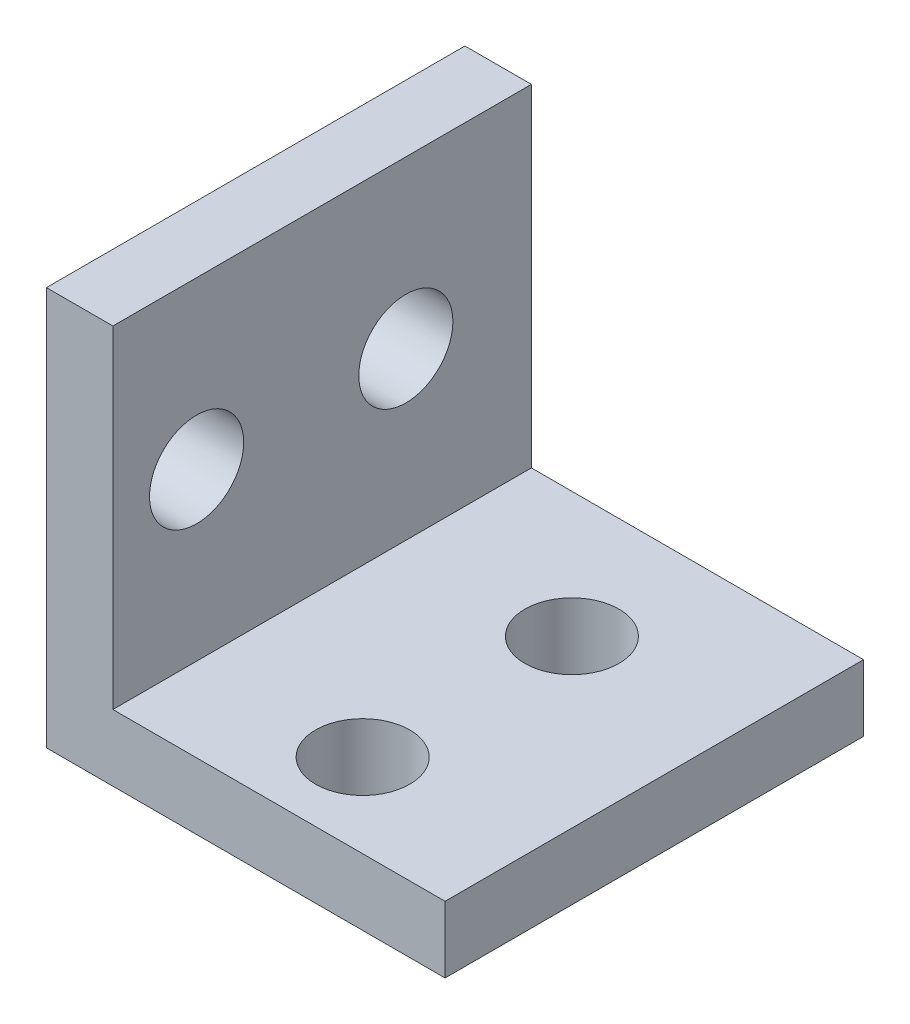
ISO-10303-21;
HEADER;
FILE_DESCRIPTION(('STEP AP214'),'2;1');
FILE_NAME('part.step','',(''),(''),'','','');
FILE_SCHEMA(('AUTOMOTIVE_DESIGN { 1 0 10303 214 1 1 1 1 }'));
ENDSEC;
DATA;
#1=APPLICATION_CONTEXT('core data for automotive mechanical design processes');
#2=APPLICATION_PROTOCOL_DEFINITION('international standard','automotive_design',2000,#1);
#3=PRODUCT_CONTEXT('',#1,'mechanical');
#4=PRODUCT('Part','Part','',(#3));
#5=PRODUCT_RELATED_PRODUCT_CATEGORY('part','',(#4));
#6=PRODUCT_DEFINITION_FORMATION('','',#4);
#7=PRODUCT_DEFINITION_CONTEXT('part definition',#1,'design');
#8=PRODUCT_DEFINITION('design','',#6,#7);
#9=PRODUCT_DEFINITION_SHAPE('','',#8);
#10=(LENGTH_UNIT() NAMED_UNIT(*) SI_UNIT(.MILLI.,.METRE.));
#11=(NAMED_UNIT(*) PLANE_ANGLE_UNIT() SI_UNIT($,.RADIAN.));
#12=(NAMED_UNIT(*) SI_UNIT($,.STERADIAN.) SOLID_ANGLE_UNIT());
#13=UNCERTAINTY_MEASURE_WITH_UNIT(LENGTH_MEASURE(1.E-05),#10,'distance_accuracy_value','');
#14=(GEOMETRIC_REPRESENTATION_CONTEXT(3) GLOBAL_UNCERTAINTY_ASSIGNED_CONTEXT((#13)) GLOBAL_UNIT_ASSIGNED_CONTEXT((#10,
#11,#12)) REPRESENTATION_CONTEXT('',''));
#15=CARTESIAN_POINT('',(0.,0.,0.));
#16=DIRECTION('',(0.,0.,1.));
#17=DIRECTION('',(1.,0.,0.));
#18=AXIS2_PLACEMENT_3D('',#15,#16,#17);
#19=CARTESIAN_POINT('',(0.,3.175,20.));
#20=DIRECTION('',(0.,-1.,0.));
#21=DIRECTION('',(0.,0.,-1.));
#22=AXIS2_PLACEMENT_3D('',#19,#20,#21);
#23=PLANE('',#22);
#24=CARTESIAN_POINT('',(11.1125,3.175,6.));
#25=DIRECTION('',(0.,1.,0.));
#26=DIRECTION('',(0.,0.,1.));
#27=AXIS2_PLACEMENT_3D('',#24,#25,#26);
#28=CIRCLE('',#27,2.25);
#29=CARTESIAN_POINT('',(11.1125,3.175,8.25));
#30=VERTEX_POINT('',#29);
#31=EDGE_CURVE('E170',#30,#30,#28,.T.);
#32=ORIENTED_EDGE('',*,*,#31,.F.);
#33=EDGE_LOOP('',(#32));
#34=FACE_BOUND('',#33,.T.);
#35=CARTESIAN_POINT('',(11.1125,3.175,16.));
#36=DIRECTION('',(0.,1.,0.));
#37=DIRECTION('',(0.,0.,1.));
#38=AXIS2_PLACEMENT_3D('',#35,#36,#37);
#39=CIRCLE('',#38,2.25);
#40=CARTESIAN_POINT('',(11.1125,3.175,18.25));
#41=VERTEX_POINT('',#40);
#42=EDGE_CURVE('E176',#41,#41,#39,.T.);
#43=ORIENTED_EDGE('',*,*,#42,.F.);
#44=EDGE_LOOP('',(#43));
#45=FACE_BOUND('',#44,.T.);
#46=DIRECTION('',(0.,0.,-1.));
#47=VECTOR('',#46,1.);
#48=CARTESIAN_POINT('',(3.175,3.175,20.));
#49=LINE('',#48,#47);
#50=CARTESIAN_POINT('',(3.175,3.175,20.));
#51=VERTEX_POINT('',#50);
#52=CARTESIAN_POINT('',(3.175,3.175,0.));
#53=VERTEX_POINT('',#52);
#54=EDGE_CURVE('E11',#51,#53,#49,.T.);
#55=ORIENTED_EDGE('',*,*,#54,.F.);
#56=DIRECTION('',(-1.,0.,0.));
#57=VECTOR('',#56,1.);
#58=CARTESIAN_POINT('',(0.,3.175,20.));
#59=LINE('',#58,#57);
#60=CARTESIAN_POINT('',(19.05,3.175,20.));
#61=VERTEX_POINT('',#60);
#62=EDGE_CURVE('E88',#61,#51,#59,.T.);
#63=ORIENTED_EDGE('',*,*,#62,.F.);
#64=DIRECTION('',(0.,0.,-1.));
#65=VECTOR('',#64,1.);
#66=CARTESIAN_POINT('',(19.05,3.175,20.));
#67=LINE('',#66,#65);
#68=CARTESIAN_POINT('',(19.05,3.175,0.));
#69=VERTEX_POINT('',#68);
#70=EDGE_CURVE('E55',#61,#69,#67,.T.);
#71=ORIENTED_EDGE('',*,*,#70,.T.);
#72=DIRECTION('',(-1.,0.,0.));
#73=VECTOR('',#72,1.);
#74=CARTESIAN_POINT('',(0.,3.175,0.));
#75=LINE('',#74,#73);
#76=EDGE_CURVE('E133',#69,#53,#75,.T.);
#77=ORIENTED_EDGE('',*,*,#76,.T.);
#78=EDGE_LOOP('',(#55,#63,#71,#77));
#79=FACE_BOUND('',#78,.T.);
#80=ADVANCED_FACE('F43',(#34,#45,#79),#23,.F.);
#81=CARTESIAN_POINT('',(19.05,0.,20.));
#82=DIRECTION('',(-1.,0.,0.));
#83=DIRECTION('',(0.,0.,1.));
#84=AXIS2_PLACEMENT_3D('',#81,#82,#83);
#85=PLANE('',#84);
#86=DIRECTION('',(0.,1.,0.));
#87=VECTOR('',#86,1.);
#88=CARTESIAN_POINT('',(19.05,0.,0.));
#89=LINE('',#88,#87);
#90=CARTESIAN_POINT('',(19.05,0.,0.));
#91=VERTEX_POINT('',#90);
#92=EDGE_CURVE('E127',#91,#69,#89,.T.);
#93=ORIENTED_EDGE('',*,*,#92,.T.);
#94=ORIENTED_EDGE('',*,*,#70,.F.);
#95=DIRECTION('',(0.,1.,0.));
#96=VECTOR('',#95,1.);
#97=CARTESIAN_POINT('',(19.05,0.,20.));
#98=LINE('',#97,#96);
#99=CARTESIAN_POINT('',(19.05,0.,20.));
#100=VERTEX_POINT('',#99);
#101=EDGE_CURVE('E136',#100,#61,#98,.T.);
#102=ORIENTED_EDGE('',*,*,#101,.F.);
#103=DIRECTION('',(0.,0.,-1.));
#104=VECTOR('',#103,1.);
#105=CARTESIAN_POINT('',(19.05,0.,20.));
#106=LINE('',#105,#104);
#107=EDGE_CURVE('E148',#100,#91,#106,.T.);
#108=ORIENTED_EDGE('',*,*,#107,.T.);
#109=EDGE_LOOP('',(#93,#94,#102,#108));
#110=FACE_BOUND('',#109,.T.);
#111=ADVANCED_FACE('F44',(#110),#85,.F.);
#112=CARTESIAN_POINT('',(0.,0.,20.));
#113=DIRECTION('',(1.,0.,0.));
#114=DIRECTION('',(0.,0.,-1.));
#115=AXIS2_PLACEMENT_3D('',#112,#113,#114);
#116=PLANE('',#115);
#117=CARTESIAN_POINT('',(0.,11.1125,6.));
#118=DIRECTION('',(1.,0.,0.));
#119=DIRECTION('',(0.,0.,-1.));
#120=AXIS2_PLACEMENT_3D('',#117,#118,#119);
#121=CIRCLE('',#120,2.25);
#122=CARTESIAN_POINT('',(0.,11.1125,3.75));
#123=VERTEX_POINT('',#122);
#124=EDGE_CURVE('E192',#123,#123,#121,.T.);
#125=ORIENTED_EDGE('',*,*,#124,.T.);
#126=EDGE_LOOP('',(#125));
#127=FACE_BOUND('',#126,.T.);
#128=CARTESIAN_POINT('',(0.,11.1125,16.));
#129=DIRECTION('',(1.,0.,0.));
#130=DIRECTION('',(0.,0.,-1.));
#131=AXIS2_PLACEMENT_3D('',#128,#129,#130);
#132=CIRCLE('',#131,2.25);
#133=CARTESIAN_POINT('',(0.,11.1125,13.75));
#134=VERTEX_POINT('',#133);
#135=EDGE_CURVE('E194',#134,#134,#132,.T.);
#136=ORIENTED_EDGE('',*,*,#135,.T.);
#137=EDGE_LOOP('',(#136));
#138=FACE_BOUND('',#137,.T.);
#139=DIRECTION('',(0.,-1.,0.));
#140=VECTOR('',#139,1.);
#141=CARTESIAN_POINT('',(0.,0.,0.));
#142=LINE('',#141,#140);
#143=CARTESIAN_POINT('',(0.,19.05,0.));
#144=VERTEX_POINT('',#143);
#145=CARTESIAN_POINT('',(0.,0.,0.));
#146=VERTEX_POINT('',#145);
#147=EDGE_CURVE('E147',#144,#146,#142,.T.);
#148=ORIENTED_EDGE('',*,*,#147,.T.);
#149=DIRECTION('',(0.,0.,-1.));
#150=VECTOR('',#149,1.);
#151=CARTESIAN_POINT('',(0.,0.,20.));
#152=LINE('',#151,#150);
#153=CARTESIAN_POINT('',(0.,0.,20.));
#154=VERTEX_POINT('',#153);
#155=EDGE_CURVE('E160',#154,#146,#152,.T.);
#156=ORIENTED_EDGE('',*,*,#155,.F.);
#157=DIRECTION('',(0.,-1.,0.));
#158=VECTOR('',#157,1.);
#159=CARTESIAN_POINT('',(0.,0.,20.));
#160=LINE('',#159,#158);
#161=CARTESIAN_POINT('',(0.,19.05,20.));
#162=VERTEX_POINT('',#161);
#163=EDGE_CURVE('E142',#162,#154,#160,.T.);
#164=ORIENTED_EDGE('',*,*,#163,.F.);
#165=DIRECTION('',(0.,0.,-1.));
#166=VECTOR('',#165,1.);
#167=CARTESIAN_POINT('',(0.,19.05,20.));
#168=LINE('',#167,#166);
#169=EDGE_CURVE('E117',#162,#144,#168,.T.);
#170=ORIENTED_EDGE('',*,*,#169,.T.);
#171=EDGE_LOOP('',(#148,#156,#164,#170));
#172=FACE_BOUND('',#171,.T.);
#173=ADVANCED_FACE('F220',(#127,#138,#172),#116,.F.);
#174=CARTESIAN_POINT('',(0.,0.,20.));
#175=DIRECTION('',(0.,1.,0.));
#176=DIRECTION('',(0.,0.,1.));
#177=AXIS2_PLACEMENT_3D('',#174,#175,#176);
#178=PLANE('',#177);
#179=CARTESIAN_POINT('',(11.1125,0.,6.));
#180=DIRECTION('',(0.,1.,0.));
#181=DIRECTION('',(0.,0.,1.));
#182=AXIS2_PLACEMENT_3D('',#179,#180,#181);
#183=CIRCLE('',#182,2.25);
#184=CARTESIAN_POINT('',(11.1125,0.,8.25));
#185=VERTEX_POINT('',#184);
#186=EDGE_CURVE('E175',#185,#185,#183,.T.);
#187=ORIENTED_EDGE('',*,*,#186,.T.);
#188=EDGE_LOOP('',(#187));
#189=FACE_BOUND('',#188,.T.);
#190=CARTESIAN_POINT('',(11.1125,0.,16.));
#191=DIRECTION('',(0.,1.,0.));
#192=DIRECTION('',(0.,0.,1.));
#193=AXIS2_PLACEMENT_3D('',#190,#191,#192);
#194=CIRCLE('',#193,2.25);
#195=CARTESIAN_POINT('',(11.1125,0.,18.25));
#196=VERTEX_POINT('',#195);
#197=EDGE_CURVE('E177',#196,#196,#194,.T.);
#198=ORIENTED_EDGE('',*,*,#197,.T.);
#199=EDGE_LOOP('',(#198));
#200=FACE_BOUND('',#199,.T.);
#201=ORIENTED_EDGE('',*,*,#107,.F.);
#202=DIRECTION('',(1.,0.,0.));
#203=VECTOR('',#202,1.);
#204=CARTESIAN_POINT('',(0.,0.,20.));
#205=LINE('',#204,#203);
#206=EDGE_CURVE('E69',#154,#100,#205,.T.);
#207=ORIENTED_EDGE('',*,*,#206,.F.);
#208=ORIENTED_EDGE('',*,*,#155,.T.);
#209=DIRECTION('',(1.,0.,0.));
#210=VECTOR('',#209,1.);
#211=CARTESIAN_POINT('',(0.,0.,0.));
#212=LINE('',#211,#210);
#213=EDGE_CURVE('E85',#146,#91,#212,.T.);
#214=ORIENTED_EDGE('',*,*,#213,.T.);
#215=EDGE_LOOP('',(#201,#207,#208,#214));
#216=FACE_BOUND('',#215,.T.);
#217=ADVANCED_FACE('F219',(#189,#200,#216),#178,.F.);
#218=CARTESIAN_POINT('',(0.,0.,20.));
#219=DIRECTION('',(0.,0.,-1.));
#220=DIRECTION('',(-1.,0.,0.));
#221=AXIS2_PLACEMENT_3D('',#218,#219,#220);
#222=PLANE('',#221);
#223=ORIENTED_EDGE('',*,*,#206,.T.);
#224=ORIENTED_EDGE('',*,*,#101,.T.);
#225=ORIENTED_EDGE('',*,*,#62,.T.);
#226=DIRECTION('',(0.,1.,0.));
#227=VECTOR('',#226,1.);
#228=CARTESIAN_POINT('',(3.175,0.,20.));
#229=LINE('',#228,#227);
#230=CARTESIAN_POINT('',(3.175,19.05,20.));
#231=VERTEX_POINT('',#230);
#232=EDGE_CURVE('E105',#51,#231,#229,.T.);
#233=ORIENTED_EDGE('',*,*,#232,.T.);
#234=DIRECTION('',(-1.,0.,0.));
#235=VECTOR('',#234,1.);
#236=CARTESIAN_POINT('',(0.,19.05,20.));
#237=LINE('',#236,#235);
#238=EDGE_CURVE('E104',#231,#162,#237,.T.);
#239=ORIENTED_EDGE('',*,*,#238,.T.);
#240=ORIENTED_EDGE('',*,*,#163,.T.);
#241=EDGE_LOOP('',(#223,#224,#225,#233,#239,#240));
#242=FACE_BOUND('',#241,.T.);
#243=ADVANCED_FACE('F102',(#242),#222,.F.);
#244=CARTESIAN_POINT('',(0.,0.,0.));
#245=DIRECTION('',(0.,0.,-1.));
#246=DIRECTION('',(-1.,0.,0.));
#247=AXIS2_PLACEMENT_3D('',#244,#245,#246);
#248=PLANE('',#247);
#249=ORIENTED_EDGE('',*,*,#147,.F.);
#250=DIRECTION('',(-1.,0.,0.));
#251=VECTOR('',#250,1.);
#252=CARTESIAN_POINT('',(0.,19.05,0.));
#253=LINE('',#252,#251);
#254=CARTESIAN_POINT('',(3.175,19.05,0.));
#255=VERTEX_POINT('',#254);
#256=EDGE_CURVE('E109',#255,#144,#253,.T.);
#257=ORIENTED_EDGE('',*,*,#256,.F.);
#258=DIRECTION('',(0.,1.,0.));
#259=VECTOR('',#258,1.);
#260=CARTESIAN_POINT('',(3.175,0.,0.));
#261=LINE('',#260,#259);
#262=EDGE_CURVE('E125',#53,#255,#261,.T.);
#263=ORIENTED_EDGE('',*,*,#262,.F.);
#264=ORIENTED_EDGE('',*,*,#76,.F.);
#265=ORIENTED_EDGE('',*,*,#92,.F.);
#266=ORIENTED_EDGE('',*,*,#213,.F.);
#267=EDGE_LOOP('',(#249,#257,#263,#264,#265,#266));
#268=FACE_BOUND('',#267,.T.);
#269=ADVANCED_FACE('F164',(#268),#248,.T.);
#270=CARTESIAN_POINT('',(3.175,0.,20.));
#271=DIRECTION('',(-1.,0.,0.));
#272=DIRECTION('',(0.,0.,1.));
#273=AXIS2_PLACEMENT_3D('',#270,#271,#272);
#274=PLANE('',#273);
#275=CARTESIAN_POINT('',(3.175,11.1125,6.));
#276=DIRECTION('',(1.,0.,0.));
#277=DIRECTION('',(0.,0.,-1.));
#278=AXIS2_PLACEMENT_3D('',#275,#276,#277);
#279=CIRCLE('',#278,2.25);
#280=CARTESIAN_POINT('',(3.175,11.1125,3.75));
#281=VERTEX_POINT('',#280);
#282=EDGE_CURVE('E182',#281,#281,#279,.T.);
#283=ORIENTED_EDGE('',*,*,#282,.F.);
#284=EDGE_LOOP('',(#283));
#285=FACE_BOUND('',#284,.T.);
#286=CARTESIAN_POINT('',(3.175,11.1125,16.));
#287=DIRECTION('',(1.,0.,0.));
#288=DIRECTION('',(0.,0.,-1.));
#289=AXIS2_PLACEMENT_3D('',#286,#287,#288);
#290=CIRCLE('',#289,2.25);
#291=CARTESIAN_POINT('',(3.175,11.1125,13.75));
#292=VERTEX_POINT('',#291);
#293=EDGE_CURVE('E187',#292,#292,#290,.T.);
#294=ORIENTED_EDGE('',*,*,#293,.F.);
#295=EDGE_LOOP('',(#294));
#296=FACE_BOUND('',#295,.T.);
#297=ORIENTED_EDGE('',*,*,#232,.F.);
#298=ORIENTED_EDGE('',*,*,#54,.T.);
#299=ORIENTED_EDGE('',*,*,#262,.T.);
#300=DIRECTION('',(0.,0.,-1.));
#301=VECTOR('',#300,1.);
#302=CARTESIAN_POINT('',(3.175,19.05,20.));
#303=LINE('',#302,#301);
#304=EDGE_CURVE('E118',#231,#255,#303,.T.);
#305=ORIENTED_EDGE('',*,*,#304,.F.);
#306=EDGE_LOOP('',(#297,#298,#299,#305));
#307=FACE_BOUND('',#306,.T.);
#308=ADVANCED_FACE('F124',(#285,#296,#307),#274,.F.);
#309=CARTESIAN_POINT('',(0.,19.05,20.));
#310=DIRECTION('',(0.,-1.,0.));
#311=DIRECTION('',(0.,0.,-1.));
#312=AXIS2_PLACEMENT_3D('',#309,#310,#311);
#313=PLANE('',#312);
#314=ORIENTED_EDGE('',*,*,#256,.T.);
#315=ORIENTED_EDGE('',*,*,#169,.F.);
#316=ORIENTED_EDGE('',*,*,#238,.F.);
#317=ORIENTED_EDGE('',*,*,#304,.T.);
#318=EDGE_LOOP('',(#314,#315,#316,#317));
#319=FACE_BOUND('',#318,.T.);
#320=ADVANCED_FACE('F113',(#319),#313,.F.);
#321=CARTESIAN_POINT('',(11.1125,3.175,16.));
#322=DIRECTION('',(0.,-1.,0.));
#323=DIRECTION('',(0.,0.,-1.));
#324=AXIS2_PLACEMENT_3D('',#321,#322,#323);
#325=CYLINDRICAL_SURFACE('',#324,2.25);
#326=ORIENTED_EDGE('',*,*,#42,.T.);
#327=EDGE_LOOP('',(#326));
#328=FACE_BOUND('',#327,.T.);
#329=ORIENTED_EDGE('',*,*,#197,.F.);
#330=EDGE_LOOP('',(#329));
#331=FACE_BOUND('',#330,.T.);
#332=ADVANCED_FACE('F238',(#328,#331),#325,.F.);
#333=CARTESIAN_POINT('',(11.1125,3.175,6.));
#334=DIRECTION('',(0.,-1.,0.));
#335=DIRECTION('',(0.,0.,-1.));
#336=AXIS2_PLACEMENT_3D('',#333,#334,#335);
#337=CYLINDRICAL_SURFACE('',#336,2.25);
#338=ORIENTED_EDGE('',*,*,#31,.T.);
#339=EDGE_LOOP('',(#338));
#340=FACE_BOUND('',#339,.T.);
#341=ORIENTED_EDGE('',*,*,#186,.F.);
#342=EDGE_LOOP('',(#341));
#343=FACE_BOUND('',#342,.T.);
#344=ADVANCED_FACE('F213',(#340,#343),#337,.F.);
#345=CARTESIAN_POINT('',(3.175,11.1125,16.));
#346=DIRECTION('',(-1.,0.,0.));
#347=DIRECTION('',(0.,0.,1.));
#348=AXIS2_PLACEMENT_3D('',#345,#346,#347);
#349=CYLINDRICAL_SURFACE('',#348,2.25);
#350=ORIENTED_EDGE('',*,*,#293,.T.);
#351=EDGE_LOOP('',(#350));
#352=FACE_BOUND('',#351,.T.);
#353=ORIENTED_EDGE('',*,*,#135,.F.);
#354=EDGE_LOOP('',(#353));
#355=FACE_BOUND('',#354,.T.);
#356=ADVANCED_FACE('F209',(#352,#355),#349,.F.);
#357=CARTESIAN_POINT('',(3.175,11.1125,6.));
#358=DIRECTION('',(-1.,0.,0.));
#359=DIRECTION('',(0.,0.,1.));
#360=AXIS2_PLACEMENT_3D('',#357,#358,#359);
#361=CYLINDRICAL_SURFACE('',#360,2.25);
#362=ORIENTED_EDGE('',*,*,#282,.T.);
#363=EDGE_LOOP('',(#362));
#364=FACE_BOUND('',#363,.T.);
#365=ORIENTED_EDGE('',*,*,#124,.F.);
#366=EDGE_LOOP('',(#365));
#367=FACE_BOUND('',#366,.T.);
#368=ADVANCED_FACE('F205',(#364,#367),#361,.F.);
#369=CLOSED_SHELL('',(#80,#111,#173,#217,#243,#269,#308,#320,#332,#344,#356,#368));
#370=MANIFOLD_SOLID_BREP('B2',#369);
#371=ADVANCED_BREP_SHAPE_REPRESENTATION('',(#18,#370),#14);
#372=SHAPE_DEFINITION_REPRESENTATION(#9,#371);
ENDSEC;
END-ISO-10303-21;
